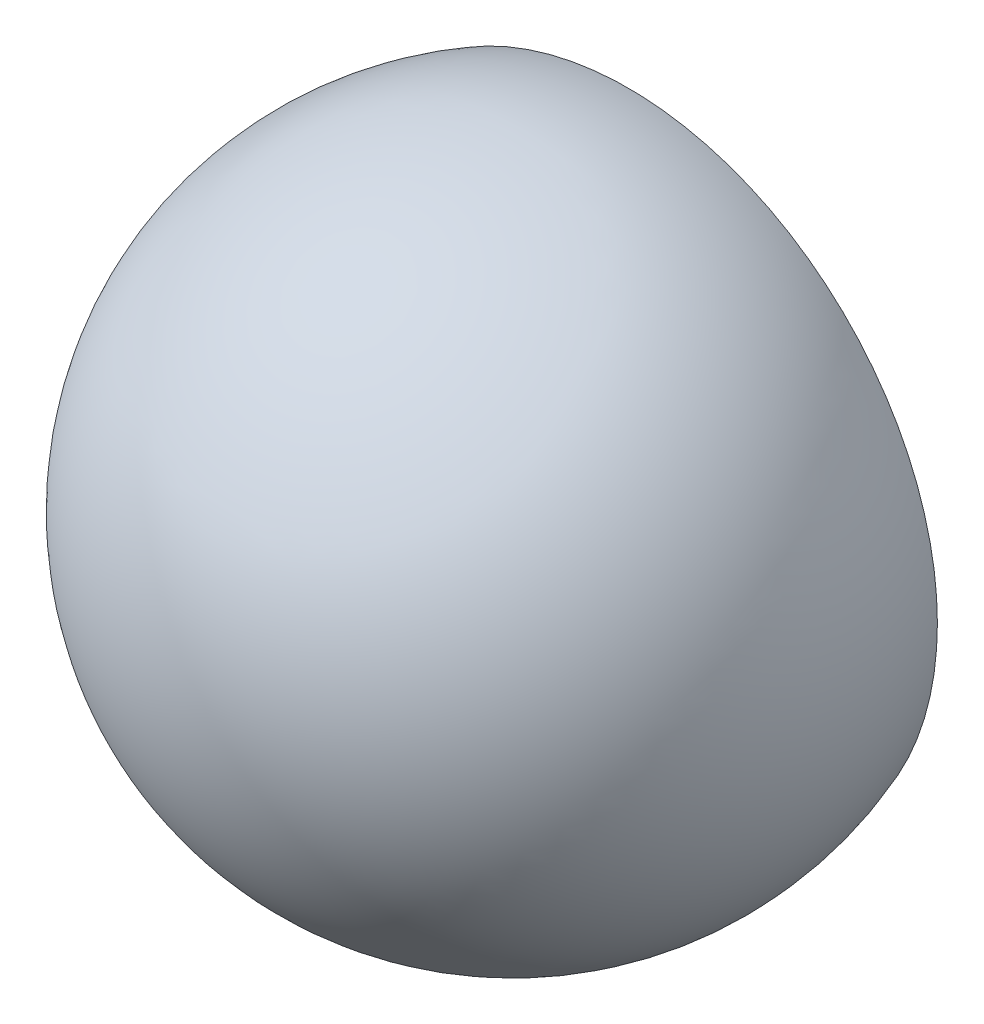
ISO-10303-21;
HEADER;
FILE_DESCRIPTION(('STEP AP214'),'2;1');
FILE_NAME('part.step','',(''),(''),'','','');
FILE_SCHEMA(('AUTOMOTIVE_DESIGN { 1 0 10303 214 1 1 1 1 }'));
ENDSEC;
DATA;
#1=APPLICATION_CONTEXT('core data for automotive mechanical design processes');
#2=APPLICATION_PROTOCOL_DEFINITION('international standard','automotive_design',2000,#1);
#3=PRODUCT_CONTEXT('',#1,'mechanical');
#4=PRODUCT('Part','Part','',(#3));
#5=PRODUCT_RELATED_PRODUCT_CATEGORY('part','',(#4));
#6=PRODUCT_DEFINITION_FORMATION('','',#4);
#7=PRODUCT_DEFINITION_CONTEXT('part definition',#1,'design');
#8=PRODUCT_DEFINITION('design','',#6,#7);
#9=PRODUCT_DEFINITION_SHAPE('','',#8);
#10=(LENGTH_UNIT() NAMED_UNIT(*) SI_UNIT(.MILLI.,.METRE.));
#11=(NAMED_UNIT(*) PLANE_ANGLE_UNIT() SI_UNIT($,.RADIAN.));
#12=(NAMED_UNIT(*) SI_UNIT($,.STERADIAN.) SOLID_ANGLE_UNIT());
#13=UNCERTAINTY_MEASURE_WITH_UNIT(LENGTH_MEASURE(1.E-05),#10,'distance_accuracy_value','');
#14=(GEOMETRIC_REPRESENTATION_CONTEXT(3) GLOBAL_UNCERTAINTY_ASSIGNED_CONTEXT((#13)) GLOBAL_UNIT_ASSIGNED_CONTEXT((#10,
#11,#12)) REPRESENTATION_CONTEXT('',''));
#15=CARTESIAN_POINT('',(0.,0.,0.));
#16=DIRECTION('',(0.,0.,1.));
#17=DIRECTION('',(1.,0.,0.));
#18=AXIS2_PLACEMENT_3D('',#15,#16,#17);
#19=CARTESIAN_POINT('',(0.,0.,87.5));
#20=DIRECTION('',(0.,-1.,0.));
#21=DIRECTION('',(0.,0.,1.));
#22=AXIS2_PLACEMENT_3D('',#19,#20,#21);
#23=SPHERICAL_SURFACE('',#22,250.);
#24=CARTESIAN_POINT('',(0.,0.,87.5));
#25=DIRECTION('',(0.,0.,1.));
#26=DIRECTION('',(1.,0.,0.));
#27=AXIS2_PLACEMENT_3D('',#24,#25,#26);
#28=SPHERICAL_SURFACE('',#27,250.);
#29=CARTESIAN_POINT('',(0.,0.,0.));
#30=DIRECTION('',(0.,0.,1.));
#31=DIRECTION('',(1.,0.,0.));
#32=AXIS2_PLACEMENT_3D('',#29,#30,#31);
#33=CIRCLE('',#32,234.18742493994);
#34=CARTESIAN_POINT('',(234.18742493994,0.,0.));
#35=VERTEX_POINT('',#34);
#36=EDGE_CURVE('E11',#35,#35,#33,.F.);
#37=ORIENTED_EDGE('',*,*,#36,.F.);
#38=EDGE_LOOP('',(#37));
#39=FACE_BOUND('',#38,.T.);
#40=ADVANCED_FACE('F45',(#39),#28,.T.);
#41=CARTESIAN_POINT('',(0.,0.,0.));
#42=DIRECTION('',(0.,0.,1.));
#43=DIRECTION('',(1.,0.,0.));
#44=AXIS2_PLACEMENT_3D('',#41,#42,#43);
#45=PLANE('',#44);
#46=CARTESIAN_POINT('',(0.,0.,0.));
#47=DIRECTION('',(0.,0.,1.));
#48=DIRECTION('',(1.,0.,0.));
#49=AXIS2_PLACEMENT_3D('',#46,#47,#48);
#50=CIRCLE('',#49,230.);
#51=CARTESIAN_POINT('',(230.,0.,0.));
#52=VERTEX_POINT('',#51);
#53=EDGE_CURVE('E48',#52,#52,#50,.T.);
#54=ORIENTED_EDGE('',*,*,#53,.T.);
#55=EDGE_LOOP('',(#54));
#56=FACE_BOUND('',#55,.T.);
#57=ORIENTED_EDGE('',*,*,#36,.T.);
#58=EDGE_LOOP('',(#57));
#59=FACE_BOUND('',#58,.T.);
#60=ADVANCED_FACE('F57',(#56,#59),#45,.F.);
#61=CARTESIAN_POINT('',(0.,0.,0.));
#62=DIRECTION('',(0.,-1.,0.));
#63=DIRECTION('',(-1.,0.,0.));
#64=AXIS2_PLACEMENT_3D('',#61,#62,#63);
#65=SPHERICAL_SURFACE('',#64,230.);
#66=CARTESIAN_POINT('',(0.,0.,0.));
#67=DIRECTION('',(0.,0.,1.));
#68=DIRECTION('',(1.,0.,0.));
#69=AXIS2_PLACEMENT_3D('',#66,#67,#68);
#70=SPHERICAL_SURFACE('',#69,230.);
#71=ORIENTED_EDGE('',*,*,#53,.F.);
#72=EDGE_LOOP('',(#71));
#73=FACE_BOUND('',#72,.T.);
#74=ADVANCED_FACE('F59',(#73),#70,.F.);
#75=CLOSED_SHELL('',(#40,#60,#74));
#76=MANIFOLD_SOLID_BREP('B2',#75);
#77=CARTESIAN_POINT('',(0.,0.,175.));
#78=DIRECTION('',(0.,0.,1.));
#79=DIRECTION('',(1.,0.,0.));
#80=AXIS2_PLACEMENT_3D('',#77,#78,#79);
#81=PLANE('',#80);
#82=CARTESIAN_POINT('',(0.,0.,175.));
#83=DIRECTION('',(0.,0.,1.));
#84=DIRECTION('',(1.,0.,0.));
#85=AXIS2_PLACEMENT_3D('',#82,#83,#84);
#86=CIRCLE('',#85,215.);
#87=CARTESIAN_POINT('',(215.,0.,175.));
#88=VERTEX_POINT('',#87);
#89=EDGE_CURVE('E44',#88,#88,#86,.T.);
#90=ORIENTED_EDGE('',*,*,#89,.T.);
#91=EDGE_LOOP('',(#90));
#92=FACE_BOUND('',#91,.T.);
#93=CARTESIAN_POINT('',(0.,0.,175.));
#94=DIRECTION('',(0.,0.,1.));
#95=DIRECTION('',(1.,0.,0.));
#96=AXIS2_PLACEMENT_3D('',#93,#94,#95);
#97=CIRCLE('',#96,210.);
#98=CARTESIAN_POINT('',(210.,0.,175.));
#99=VERTEX_POINT('',#98);
#100=EDGE_CURVE('E94',#99,#99,#97,.T.);
#101=ORIENTED_EDGE('',*,*,#100,.F.);
#102=EDGE_LOOP('',(#101));
#103=FACE_BOUND('',#102,.T.);
#104=ADVANCED_FACE('F86',(#92,#103),#81,.T.);
#105=CARTESIAN_POINT('',(0.,0.,175.));
#106=DIRECTION('',(0.,0.,-1.));
#107=DIRECTION('',(-1.,0.,0.));
#108=AXIS2_PLACEMENT_3D('',#105,#106,#107);
#109=CYLINDRICAL_SURFACE('',#108,215.);
#110=CARTESIAN_POINT('',(0.,0.,81.700673191841));
#111=DIRECTION('',(0.,0.,-1.));
#112=DIRECTION('',(-1.,0.,0.));
#113=AXIS2_PLACEMENT_3D('',#110,#111,#112);
#114=CIRCLE('',#113,215.);
#115=CARTESIAN_POINT('',(-215.,0.,81.700673191841));
#116=VERTEX_POINT('',#115);
#117=EDGE_CURVE('E98',#116,#116,#114,.F.);
#118=ORIENTED_EDGE('',*,*,#117,.T.);
#119=EDGE_LOOP('',(#118));
#120=FACE_BOUND('',#119,.T.);
#121=ORIENTED_EDGE('',*,*,#89,.F.);
#122=EDGE_LOOP('',(#121));
#123=FACE_BOUND('',#122,.T.);
#124=ADVANCED_FACE('F88',(#120,#123),#109,.T.);
#125=CARTESIAN_POINT('',(0.,0.,175.));
#126=DIRECTION('',(0.,0.,-1.));
#127=DIRECTION('',(-1.,0.,0.));
#128=AXIS2_PLACEMENT_3D('',#125,#126,#127);
#129=CYLINDRICAL_SURFACE('',#128,210.);
#130=CARTESIAN_POINT('',(0.,0.,93.8083151964686));
#131=DIRECTION('',(0.,0.,-1.));
#132=DIRECTION('',(-1.,0.,0.));
#133=AXIS2_PLACEMENT_3D('',#130,#131,#132);
#134=CIRCLE('',#133,210.);
#135=CARTESIAN_POINT('',(-210.,0.,93.8083151964686));
#136=VERTEX_POINT('',#135);
#137=EDGE_CURVE('E90',#136,#136,#134,.F.);
#138=ORIENTED_EDGE('',*,*,#137,.F.);
#139=EDGE_LOOP('',(#138));
#140=FACE_BOUND('',#139,.T.);
#141=ORIENTED_EDGE('',*,*,#100,.T.);
#142=EDGE_LOOP('',(#141));
#143=FACE_BOUND('',#142,.T.);
#144=ADVANCED_FACE('F110',(#140,#143),#129,.F.);
#145=CARTESIAN_POINT('',(0.,0.,0.));
#146=DIRECTION('',(0.,-1.,0.));
#147=DIRECTION('',(-1.,0.,0.));
#148=AXIS2_PLACEMENT_3D('',#145,#146,#147);
#149=SPHERICAL_SURFACE('',#148,230.);
#150=CARTESIAN_POINT('',(0.,0.,0.));
#151=DIRECTION('',(0.,0.,-1.));
#152=DIRECTION('',(-1.,0.,0.));
#153=AXIS2_PLACEMENT_3D('',#150,#151,#152);
#154=SPHERICAL_SURFACE('',#153,230.);
#155=ORIENTED_EDGE('',*,*,#137,.T.);
#156=EDGE_LOOP('',(#155));
#157=FACE_BOUND('',#156,.T.);
#158=ORIENTED_EDGE('',*,*,#117,.F.);
#159=EDGE_LOOP('',(#158));
#160=FACE_BOUND('',#159,.T.);
#161=ADVANCED_FACE('F107',(#157,#160),#154,.F.);
#162=CLOSED_SHELL('',(#104,#124,#144,#161));
#163=MANIFOLD_SOLID_BREP('B6',#162);
#164=ADVANCED_BREP_SHAPE_REPRESENTATION('',(#18,#76,#163),#14);
#165=SHAPE_DEFINITION_REPRESENTATION(#9,#164);
ENDSEC;
END-ISO-10303-21;
